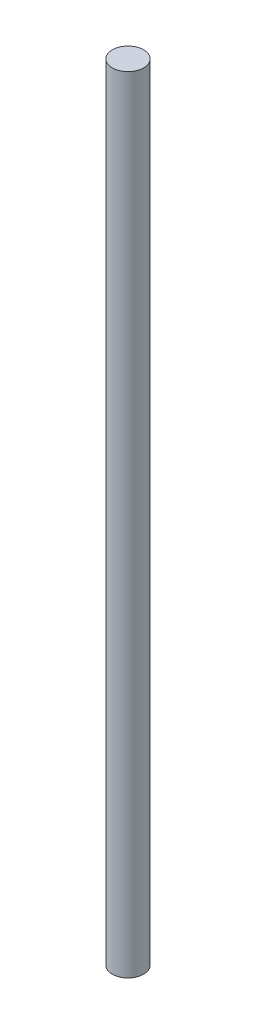
ISO-10303-21;
HEADER;
FILE_DESCRIPTION(('STEP AP214'),'2;1');
FILE_NAME('part.step','',(''),(''),'','','');
FILE_SCHEMA(('AUTOMOTIVE_DESIGN { 1 0 10303 214 1 1 1 1 }'));
ENDSEC;
DATA;
#1=APPLICATION_CONTEXT('core data for automotive mechanical design processes');
#2=APPLICATION_PROTOCOL_DEFINITION('international standard','automotive_design',2000,#1);
#3=PRODUCT_CONTEXT('',#1,'mechanical');
#4=PRODUCT('Part','Part','',(#3));
#5=PRODUCT_RELATED_PRODUCT_CATEGORY('part','',(#4));
#6=PRODUCT_DEFINITION_FORMATION('','',#4);
#7=PRODUCT_DEFINITION_CONTEXT('part definition',#1,'design');
#8=PRODUCT_DEFINITION('design','',#6,#7);
#9=PRODUCT_DEFINITION_SHAPE('','',#8);
#10=(LENGTH_UNIT() NAMED_UNIT(*) SI_UNIT(.MILLI.,.METRE.));
#11=(NAMED_UNIT(*) PLANE_ANGLE_UNIT() SI_UNIT($,.RADIAN.));
#12=(NAMED_UNIT(*) SI_UNIT($,.STERADIAN.) SOLID_ANGLE_UNIT());
#13=UNCERTAINTY_MEASURE_WITH_UNIT(LENGTH_MEASURE(1.E-05),#10,'distance_accuracy_value','');
#14=(GEOMETRIC_REPRESENTATION_CONTEXT(3) GLOBAL_UNCERTAINTY_ASSIGNED_CONTEXT((#13)) GLOBAL_UNIT_ASSIGNED_CONTEXT((#10,
#11,#12)) REPRESENTATION_CONTEXT('',''));
#15=CARTESIAN_POINT('',(0.,0.,0.));
#16=DIRECTION('',(0.,0.,1.));
#17=DIRECTION('',(1.,0.,0.));
#18=AXIS2_PLACEMENT_3D('',#15,#16,#17);
#19=CARTESIAN_POINT('',(0.,150.,0.));
#20=DIRECTION('',(0.,-1.,0.));
#21=DIRECTION('',(0.,0.,-1.));
#22=AXIS2_PLACEMENT_3D('',#19,#20,#21);
#23=CYLINDRICAL_SURFACE('',#22,3.);
#24=CARTESIAN_POINT('',(0.,150.,0.));
#25=DIRECTION('',(0.,1.,0.));
#26=DIRECTION('',(0.,0.,1.));
#27=AXIS2_PLACEMENT_3D('',#24,#25,#26);
#28=CIRCLE('',#27,3.);
#29=CARTESIAN_POINT('',(0.,150.,3.));
#30=VERTEX_POINT('',#29);
#31=EDGE_CURVE('E10',#30,#30,#28,.T.);
#32=ORIENTED_EDGE('',*,*,#31,.F.);
#33=EDGE_LOOP('',(#32));
#34=FACE_BOUND('',#33,.T.);
#35=CARTESIAN_POINT('',(0.,0.,0.));
#36=DIRECTION('',(0.,1.,0.));
#37=DIRECTION('',(0.,0.,1.));
#38=AXIS2_PLACEMENT_3D('',#35,#36,#37);
#39=CIRCLE('',#38,3.);
#40=CARTESIAN_POINT('',(0.,0.,3.));
#41=VERTEX_POINT('',#40);
#42=EDGE_CURVE('E40',#41,#41,#39,.T.);
#43=ORIENTED_EDGE('',*,*,#42,.T.);
#44=EDGE_LOOP('',(#43));
#45=FACE_BOUND('',#44,.T.);
#46=ADVANCED_FACE('F37',(#34,#45),#23,.T.);
#47=CARTESIAN_POINT('',(0.,150.,0.));
#48=DIRECTION('',(0.,1.,0.));
#49=DIRECTION('',(0.,0.,1.));
#50=AXIS2_PLACEMENT_3D('',#47,#48,#49);
#51=PLANE('',#50);
#52=ORIENTED_EDGE('',*,*,#31,.T.);
#53=EDGE_LOOP('',(#52));
#54=FACE_BOUND('',#53,.T.);
#55=ADVANCED_FACE('F54',(#54),#51,.T.);
#56=CARTESIAN_POINT('',(0.,0.,0.));
#57=DIRECTION('',(0.,1.,0.));
#58=DIRECTION('',(0.,0.,1.));
#59=AXIS2_PLACEMENT_3D('',#56,#57,#58);
#60=PLANE('',#59);
#61=ORIENTED_EDGE('',*,*,#42,.F.);
#62=EDGE_LOOP('',(#61));
#63=FACE_BOUND('',#62,.T.);
#64=ADVANCED_FACE('F52',(#63),#60,.F.);
#65=CLOSED_SHELL('',(#46,#55,#64));
#66=MANIFOLD_SOLID_BREP('B2',#65);
#67=ADVANCED_BREP_SHAPE_REPRESENTATION('',(#18,#66),#14);
#68=SHAPE_DEFINITION_REPRESENTATION(#9,#67);
ENDSEC;
END-ISO-10303-21;
